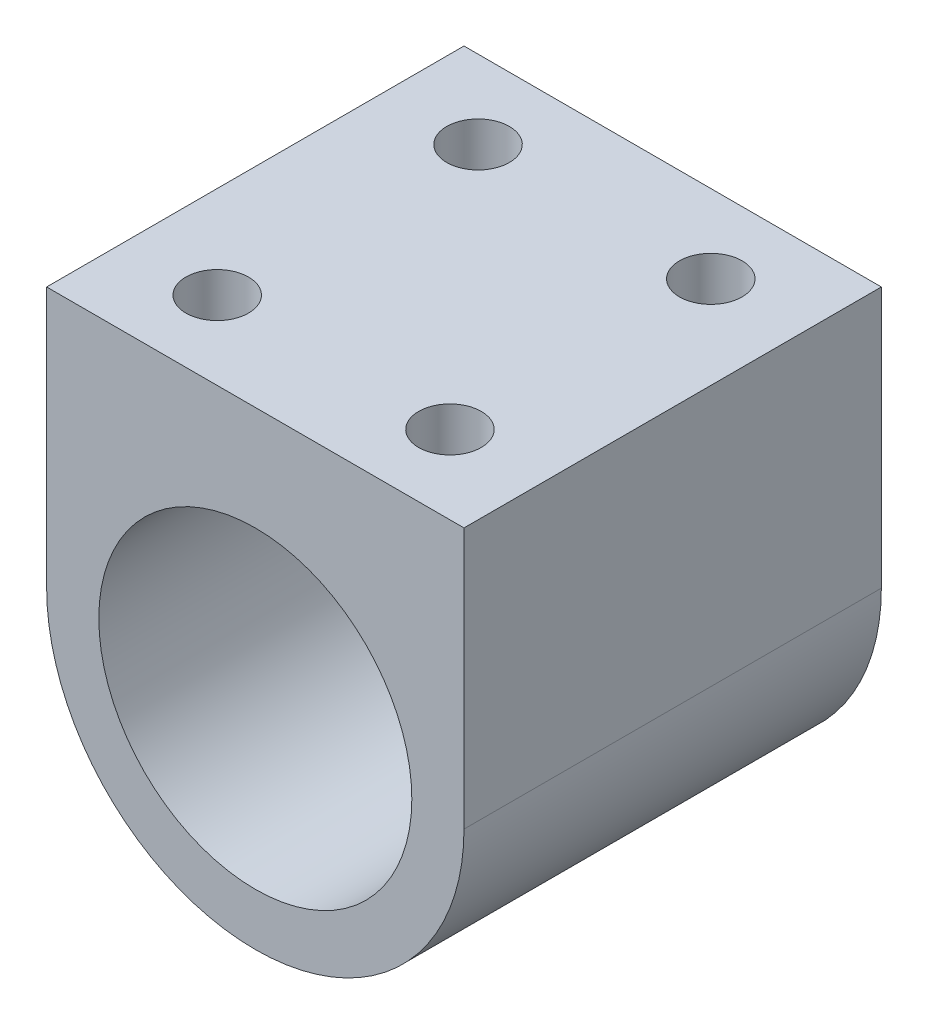
ISO-10303-21;
HEADER;
FILE_DESCRIPTION(('STEP AP214'),'2;1');
FILE_NAME('part.step','',(''),(''),'','','');
FILE_SCHEMA(('AUTOMOTIVE_DESIGN { 1 0 10303 214 1 1 1 1 }'));
ENDSEC;
DATA;
#1=APPLICATION_CONTEXT('core data for automotive mechanical design processes');
#2=APPLICATION_PROTOCOL_DEFINITION('international standard','automotive_design',2000,#1);
#3=PRODUCT_CONTEXT('',#1,'mechanical');
#4=PRODUCT('Part','Part','',(#3));
#5=PRODUCT_RELATED_PRODUCT_CATEGORY('part','',(#4));
#6=PRODUCT_DEFINITION_FORMATION('','',#4);
#7=PRODUCT_DEFINITION_CONTEXT('part definition',#1,'design');
#8=PRODUCT_DEFINITION('design','',#6,#7);
#9=PRODUCT_DEFINITION_SHAPE('','',#8);
#10=(LENGTH_UNIT() NAMED_UNIT(*) SI_UNIT(.MILLI.,.METRE.));
#11=(NAMED_UNIT(*) PLANE_ANGLE_UNIT() SI_UNIT($,.RADIAN.));
#12=(NAMED_UNIT(*) SI_UNIT($,.STERADIAN.) SOLID_ANGLE_UNIT());
#13=UNCERTAINTY_MEASURE_WITH_UNIT(LENGTH_MEASURE(1.E-05),#10,'distance_accuracy_value','');
#14=(GEOMETRIC_REPRESENTATION_CONTEXT(3) GLOBAL_UNCERTAINTY_ASSIGNED_CONTEXT((#13)) GLOBAL_UNIT_ASSIGNED_CONTEXT((#10,
#11,#12)) REPRESENTATION_CONTEXT('',''));
#15=CARTESIAN_POINT('',(0.,0.,0.));
#16=DIRECTION('',(0.,0.,1.));
#17=DIRECTION('',(1.,0.,0.));
#18=AXIS2_PLACEMENT_3D('',#15,#16,#17);
#19=CARTESIAN_POINT('',(0.,0.,40.));
#20=DIRECTION('',(0.,0.,-1.));
#21=DIRECTION('',(-1.,0.,0.));
#22=AXIS2_PLACEMENT_3D('',#19,#20,#21);
#23=CYLINDRICAL_SURFACE('',#22,20.);
#24=CARTESIAN_POINT('',(0.,0.,0.));
#25=DIRECTION('',(0.,0.,1.));
#26=DIRECTION('',(1.,0.,0.));
#27=AXIS2_PLACEMENT_3D('',#24,#25,#26);
#28=CIRCLE('',#27,20.);
#29=CARTESIAN_POINT('',(-20.,0.,0.));
#30=VERTEX_POINT('',#29);
#31=CARTESIAN_POINT('',(20.,0.,0.));
#32=VERTEX_POINT('',#31);
#33=EDGE_CURVE('E100',#30,#32,#28,.T.);
#34=ORIENTED_EDGE('',*,*,#33,.T.);
#35=DIRECTION('',(0.,0.,-1.));
#36=VECTOR('',#35,1.);
#37=CARTESIAN_POINT('',(20.,0.,40.));
#38=LINE('',#37,#36);
#39=CARTESIAN_POINT('',(20.,0.,40.));
#40=VERTEX_POINT('',#39);
#41=EDGE_CURVE('E11',#40,#32,#38,.T.);
#42=ORIENTED_EDGE('',*,*,#41,.F.);
#43=CARTESIAN_POINT('',(0.,0.,40.));
#44=DIRECTION('',(0.,0.,1.));
#45=DIRECTION('',(1.,0.,0.));
#46=AXIS2_PLACEMENT_3D('',#43,#44,#45);
#47=CIRCLE('',#46,20.);
#48=CARTESIAN_POINT('',(-20.,0.,40.));
#49=VERTEX_POINT('',#48);
#50=EDGE_CURVE('E88',#49,#40,#47,.T.);
#51=ORIENTED_EDGE('',*,*,#50,.F.);
#52=DIRECTION('',(0.,0.,-1.));
#53=VECTOR('',#52,1.);
#54=CARTESIAN_POINT('',(-20.,0.,40.));
#55=LINE('',#54,#53);
#56=EDGE_CURVE('E96',#49,#30,#55,.T.);
#57=ORIENTED_EDGE('',*,*,#56,.T.);
#58=EDGE_LOOP('',(#34,#42,#51,#57));
#59=FACE_BOUND('',#58,.T.);
#60=ADVANCED_FACE('F37',(#59),#23,.T.);
#61=CARTESIAN_POINT('',(20.,25.,40.));
#62=DIRECTION('',(-1.,0.,0.));
#63=DIRECTION('',(0.,0.,1.));
#64=AXIS2_PLACEMENT_3D('',#61,#62,#63);
#65=PLANE('',#64);
#66=DIRECTION('',(0.,1.,0.));
#67=VECTOR('',#66,1.);
#68=CARTESIAN_POINT('',(20.,25.,0.));
#69=LINE('',#68,#67);
#70=CARTESIAN_POINT('',(20.,25.,0.));
#71=VERTEX_POINT('',#70);
#72=EDGE_CURVE('E92',#32,#71,#69,.T.);
#73=ORIENTED_EDGE('',*,*,#72,.T.);
#74=DIRECTION('',(0.,0.,-1.));
#75=VECTOR('',#74,1.);
#76=CARTESIAN_POINT('',(20.,25.,40.));
#77=LINE('',#76,#75);
#78=CARTESIAN_POINT('',(20.,25.,40.));
#79=VERTEX_POINT('',#78);
#80=EDGE_CURVE('E45',#79,#71,#77,.T.);
#81=ORIENTED_EDGE('',*,*,#80,.F.);
#82=DIRECTION('',(0.,1.,0.));
#83=VECTOR('',#82,1.);
#84=CARTESIAN_POINT('',(20.,25.,40.));
#85=LINE('',#84,#83);
#86=EDGE_CURVE('E83',#40,#79,#85,.T.);
#87=ORIENTED_EDGE('',*,*,#86,.F.);
#88=ORIENTED_EDGE('',*,*,#41,.T.);
#89=EDGE_LOOP('',(#73,#81,#87,#88));
#90=FACE_BOUND('',#89,.T.);
#91=ADVANCED_FACE('F91',(#90),#65,.F.);
#92=CARTESIAN_POINT('',(20.,25.,40.));
#93=DIRECTION('',(0.,-1.,0.));
#94=DIRECTION('',(0.,0.,-1.));
#95=AXIS2_PLACEMENT_3D('',#92,#93,#94);
#96=PLANE('',#95);
#97=CARTESIAN_POINT('',(-11.1539641975774,25.,7.5));
#98=DIRECTION('',(0.,1.,0.));
#99=DIRECTION('',(0.,0.,-1.));
#100=AXIS2_PLACEMENT_3D('',#97,#98,#99);
#101=CIRCLE('',#100,3.);
#102=CARTESIAN_POINT('',(-11.1539641975774,25.,4.5));
#103=VERTEX_POINT('',#102);
#104=EDGE_CURVE('E123',#103,#103,#101,.T.);
#105=ORIENTED_EDGE('',*,*,#104,.F.);
#106=EDGE_LOOP('',(#105));
#107=FACE_BOUND('',#106,.T.);
#108=CARTESIAN_POINT('',(11.1539641975774,25.,32.5));
#109=DIRECTION('',(0.,1.,0.));
#110=DIRECTION('',(0.,0.,1.));
#111=AXIS2_PLACEMENT_3D('',#108,#109,#110);
#112=CIRCLE('',#111,3.);
#113=CARTESIAN_POINT('',(11.1539641975774,25.,35.5));
#114=VERTEX_POINT('',#113);
#115=EDGE_CURVE('E129',#114,#114,#112,.T.);
#116=ORIENTED_EDGE('',*,*,#115,.F.);
#117=EDGE_LOOP('',(#116));
#118=FACE_BOUND('',#117,.T.);
#119=CARTESIAN_POINT('',(-11.1539641975774,25.,32.5));
#120=DIRECTION('',(0.,1.,0.));
#121=DIRECTION('',(0.,0.,-1.));
#122=AXIS2_PLACEMENT_3D('',#119,#120,#121);
#123=CIRCLE('',#122,3.);
#124=CARTESIAN_POINT('',(-11.1539641975774,25.,29.5));
#125=VERTEX_POINT('',#124);
#126=EDGE_CURVE('E130',#125,#125,#123,.T.);
#127=ORIENTED_EDGE('',*,*,#126,.F.);
#128=EDGE_LOOP('',(#127));
#129=FACE_BOUND('',#128,.T.);
#130=CARTESIAN_POINT('',(11.1539641975774,25.,7.5));
#131=DIRECTION('',(0.,1.,0.));
#132=DIRECTION('',(0.,0.,1.));
#133=AXIS2_PLACEMENT_3D('',#130,#131,#132);
#134=CIRCLE('',#133,3.);
#135=CARTESIAN_POINT('',(11.1539641975774,25.,10.5));
#136=VERTEX_POINT('',#135);
#137=EDGE_CURVE('E120',#136,#136,#134,.T.);
#138=ORIENTED_EDGE('',*,*,#137,.F.);
#139=EDGE_LOOP('',(#138));
#140=FACE_BOUND('',#139,.T.);
#141=DIRECTION('',(-1.,0.,0.));
#142=VECTOR('',#141,1.);
#143=CARTESIAN_POINT('',(20.,25.,0.));
#144=LINE('',#143,#142);
#145=CARTESIAN_POINT('',(-20.,25.,0.));
#146=VERTEX_POINT('',#145);
#147=EDGE_CURVE('E70',#71,#146,#144,.T.);
#148=ORIENTED_EDGE('',*,*,#147,.T.);
#149=DIRECTION('',(0.,0.,-1.));
#150=VECTOR('',#149,1.);
#151=CARTESIAN_POINT('',(-20.,25.,40.));
#152=LINE('',#151,#150);
#153=CARTESIAN_POINT('',(-20.,25.,40.));
#154=VERTEX_POINT('',#153);
#155=EDGE_CURVE('E93',#154,#146,#152,.T.);
#156=ORIENTED_EDGE('',*,*,#155,.F.);
#157=DIRECTION('',(-1.,0.,0.));
#158=VECTOR('',#157,1.);
#159=CARTESIAN_POINT('',(20.,25.,40.));
#160=LINE('',#159,#158);
#161=EDGE_CURVE('E86',#79,#154,#160,.T.);
#162=ORIENTED_EDGE('',*,*,#161,.F.);
#163=ORIENTED_EDGE('',*,*,#80,.T.);
#164=EDGE_LOOP('',(#148,#156,#162,#163));
#165=FACE_BOUND('',#164,.T.);
#166=ADVANCED_FACE('F94',(#107,#118,#129,#140,#165),#96,.F.);
#167=CARTESIAN_POINT('',(-20.,25.,40.));
#168=DIRECTION('',(1.,0.,0.));
#169=DIRECTION('',(0.,0.,-1.));
#170=AXIS2_PLACEMENT_3D('',#167,#168,#169);
#171=PLANE('',#170);
#172=DIRECTION('',(0.,-1.,0.));
#173=VECTOR('',#172,1.);
#174=CARTESIAN_POINT('',(-20.,25.,0.));
#175=LINE('',#174,#173);
#176=EDGE_CURVE('E76',#146,#30,#175,.T.);
#177=ORIENTED_EDGE('',*,*,#176,.T.);
#178=ORIENTED_EDGE('',*,*,#56,.F.);
#179=DIRECTION('',(0.,-1.,0.));
#180=VECTOR('',#179,1.);
#181=CARTESIAN_POINT('',(-20.,25.,40.));
#182=LINE('',#181,#180);
#183=EDGE_CURVE('E53',#154,#49,#182,.T.);
#184=ORIENTED_EDGE('',*,*,#183,.F.);
#185=ORIENTED_EDGE('',*,*,#155,.T.);
#186=EDGE_LOOP('',(#177,#178,#184,#185));
#187=FACE_BOUND('',#186,.T.);
#188=ADVANCED_FACE('F108',(#187),#171,.F.);
#189=CARTESIAN_POINT('',(0.,0.,40.));
#190=DIRECTION('',(0.,0.,1.));
#191=DIRECTION('',(1.,0.,0.));
#192=AXIS2_PLACEMENT_3D('',#189,#190,#191);
#193=PLANE('',#192);
#194=CARTESIAN_POINT('',(0.,0.,40.));
#195=DIRECTION('',(0.,0.,1.));
#196=DIRECTION('',(1.,0.,0.));
#197=AXIS2_PLACEMENT_3D('',#194,#195,#196);
#198=CIRCLE('',#197,15.);
#199=CARTESIAN_POINT('',(15.,0.,40.));
#200=VERTEX_POINT('',#199);
#201=EDGE_CURVE('E114',#200,#200,#198,.T.);
#202=ORIENTED_EDGE('',*,*,#201,.F.);
#203=EDGE_LOOP('',(#202));
#204=FACE_BOUND('',#203,.T.);
#205=ORIENTED_EDGE('',*,*,#50,.T.);
#206=ORIENTED_EDGE('',*,*,#86,.T.);
#207=ORIENTED_EDGE('',*,*,#161,.T.);
#208=ORIENTED_EDGE('',*,*,#183,.T.);
#209=EDGE_LOOP('',(#205,#206,#207,#208));
#210=FACE_BOUND('',#209,.T.);
#211=ADVANCED_FACE('F84',(#204,#210),#193,.T.);
#212=CARTESIAN_POINT('',(0.,0.,0.));
#213=DIRECTION('',(0.,0.,1.));
#214=DIRECTION('',(1.,0.,0.));
#215=AXIS2_PLACEMENT_3D('',#212,#213,#214);
#216=PLANE('',#215);
#217=ORIENTED_EDGE('',*,*,#33,.F.);
#218=ORIENTED_EDGE('',*,*,#176,.F.);
#219=ORIENTED_EDGE('',*,*,#147,.F.);
#220=ORIENTED_EDGE('',*,*,#72,.F.);
#221=EDGE_LOOP('',(#217,#218,#219,#220));
#222=FACE_BOUND('',#221,.T.);
#223=ADVANCED_FACE('F111',(#222),#216,.F.);
#224=CARTESIAN_POINT('',(0.,0.,5.));
#225=DIRECTION('',(0.,0.,1.));
#226=DIRECTION('',(1.,0.,0.));
#227=AXIS2_PLACEMENT_3D('',#224,#225,#226);
#228=CYLINDRICAL_SURFACE('',#227,15.);
#229=CARTESIAN_POINT('',(0.,0.,5.));
#230=DIRECTION('',(0.,0.,1.));
#231=DIRECTION('',(1.,0.,0.));
#232=AXIS2_PLACEMENT_3D('',#229,#230,#231);
#233=CIRCLE('',#232,15.);
#234=CARTESIAN_POINT('',(15.,0.,5.));
#235=VERTEX_POINT('',#234);
#236=EDGE_CURVE('E103',#235,#235,#233,.T.);
#237=ORIENTED_EDGE('',*,*,#236,.F.);
#238=EDGE_LOOP('',(#237));
#239=FACE_BOUND('',#238,.T.);
#240=ORIENTED_EDGE('',*,*,#201,.T.);
#241=EDGE_LOOP('',(#240));
#242=FACE_BOUND('',#241,.T.);
#243=ADVANCED_FACE('F164',(#239,#242),#228,.F.);
#244=CARTESIAN_POINT('',(0.,0.,5.));
#245=DIRECTION('',(0.,0.,1.));
#246=DIRECTION('',(1.,0.,0.));
#247=AXIS2_PLACEMENT_3D('',#244,#245,#246);
#248=PLANE('',#247);
#249=ORIENTED_EDGE('',*,*,#236,.T.);
#250=EDGE_LOOP('',(#249));
#251=FACE_BOUND('',#250,.T.);
#252=ADVANCED_FACE('F155',(#251),#248,.T.);
#253=CARTESIAN_POINT('',(11.1539641975774,13.,7.5));
#254=DIRECTION('',(0.,1.,0.));
#255=DIRECTION('',(0.,0.,1.));
#256=AXIS2_PLACEMENT_3D('',#253,#254,#255);
#257=CYLINDRICAL_SURFACE('',#256,3.);
#258=CARTESIAN_POINT('',(11.1539641975774,13.,7.5));
#259=DIRECTION('',(0.,1.,0.));
#260=DIRECTION('',(0.,0.,1.));
#261=AXIS2_PLACEMENT_3D('',#258,#259,#260);
#262=CIRCLE('',#261,3.);
#263=CARTESIAN_POINT('',(11.1539641975774,13.,10.5));
#264=VERTEX_POINT('',#263);
#265=EDGE_CURVE('E117',#264,#264,#262,.T.);
#266=ORIENTED_EDGE('',*,*,#265,.F.);
#267=EDGE_LOOP('',(#266));
#268=FACE_BOUND('',#267,.T.);
#269=ORIENTED_EDGE('',*,*,#137,.T.);
#270=EDGE_LOOP('',(#269));
#271=FACE_BOUND('',#270,.T.);
#272=ADVANCED_FACE('F152',(#268,#271),#257,.F.);
#273=CARTESIAN_POINT('',(11.1539641975774,13.,7.5));
#274=DIRECTION('',(0.,1.,0.));
#275=DIRECTION('',(0.,0.,1.));
#276=AXIS2_PLACEMENT_3D('',#273,#274,#275);
#277=PLANE('',#276);
#278=ORIENTED_EDGE('',*,*,#265,.T.);
#279=EDGE_LOOP('',(#278));
#280=FACE_BOUND('',#279,.T.);
#281=ADVANCED_FACE('F154',(#280),#277,.T.);
#282=CARTESIAN_POINT('',(-11.1539641975774,13.,32.5));
#283=DIRECTION('',(0.,1.,0.));
#284=DIRECTION('',(0.,0.,1.));
#285=AXIS2_PLACEMENT_3D('',#282,#283,#284);
#286=CYLINDRICAL_SURFACE('',#285,3.);
#287=CARTESIAN_POINT('',(-11.1539641975774,13.,32.5));
#288=DIRECTION('',(0.,1.,0.));
#289=DIRECTION('',(0.,0.,-1.));
#290=AXIS2_PLACEMENT_3D('',#287,#288,#289);
#291=CIRCLE('',#290,3.);
#292=CARTESIAN_POINT('',(-11.1539641975774,13.,29.5));
#293=VERTEX_POINT('',#292);
#294=EDGE_CURVE('E138',#293,#293,#291,.T.);
#295=ORIENTED_EDGE('',*,*,#294,.F.);
#296=EDGE_LOOP('',(#295));
#297=FACE_BOUND('',#296,.T.);
#298=ORIENTED_EDGE('',*,*,#126,.T.);
#299=EDGE_LOOP('',(#298));
#300=FACE_BOUND('',#299,.T.);
#301=ADVANCED_FACE('F144',(#297,#300),#286,.F.);
#302=CARTESIAN_POINT('',(-11.1539641975774,13.,32.5));
#303=DIRECTION('',(0.,-1.,0.));
#304=DIRECTION('',(0.,0.,-1.));
#305=AXIS2_PLACEMENT_3D('',#302,#303,#304);
#306=PLANE('',#305);
#307=ORIENTED_EDGE('',*,*,#294,.T.);
#308=EDGE_LOOP('',(#307));
#309=FACE_BOUND('',#308,.T.);
#310=ADVANCED_FACE('F227',(#309),#306,.F.);
#311=CARTESIAN_POINT('',(11.1539641975774,13.,32.5));
#312=DIRECTION('',(0.,1.,0.));
#313=DIRECTION('',(0.,0.,1.));
#314=AXIS2_PLACEMENT_3D('',#311,#312,#313);
#315=CYLINDRICAL_SURFACE('',#314,3.);
#316=CARTESIAN_POINT('',(11.1539641975774,13.,32.5));
#317=DIRECTION('',(0.,1.,0.));
#318=DIRECTION('',(0.,0.,1.));
#319=AXIS2_PLACEMENT_3D('',#316,#317,#318);
#320=CIRCLE('',#319,3.);
#321=CARTESIAN_POINT('',(11.1539641975774,13.,35.5));
#322=VERTEX_POINT('',#321);
#323=EDGE_CURVE('E126',#322,#322,#320,.T.);
#324=ORIENTED_EDGE('',*,*,#323,.F.);
#325=EDGE_LOOP('',(#324));
#326=FACE_BOUND('',#325,.T.);
#327=ORIENTED_EDGE('',*,*,#115,.T.);
#328=EDGE_LOOP('',(#327));
#329=FACE_BOUND('',#328,.T.);
#330=ADVANCED_FACE('F238',(#326,#329),#315,.F.);
#331=CARTESIAN_POINT('',(11.1539641975774,13.,32.5));
#332=DIRECTION('',(0.,1.,0.));
#333=DIRECTION('',(0.,0.,1.));
#334=AXIS2_PLACEMENT_3D('',#331,#332,#333);
#335=PLANE('',#334);
#336=ORIENTED_EDGE('',*,*,#323,.T.);
#337=EDGE_LOOP('',(#336));
#338=FACE_BOUND('',#337,.T.);
#339=ADVANCED_FACE('F249',(#338),#335,.T.);
#340=CARTESIAN_POINT('',(-11.1539641975774,13.,7.5));
#341=DIRECTION('',(0.,1.,0.));
#342=DIRECTION('',(0.,0.,1.));
#343=AXIS2_PLACEMENT_3D('',#340,#341,#342);
#344=CYLINDRICAL_SURFACE('',#343,3.);
#345=CARTESIAN_POINT('',(-11.1539641975774,13.,7.5));
#346=DIRECTION('',(0.,1.,0.));
#347=DIRECTION('',(0.,0.,-1.));
#348=AXIS2_PLACEMENT_3D('',#345,#346,#347);
#349=CIRCLE('',#348,3.);
#350=CARTESIAN_POINT('',(-11.1539641975774,13.,4.5));
#351=VERTEX_POINT('',#350);
#352=EDGE_CURVE('E133',#351,#351,#349,.T.);
#353=ORIENTED_EDGE('',*,*,#352,.F.);
#354=EDGE_LOOP('',(#353));
#355=FACE_BOUND('',#354,.T.);
#356=ORIENTED_EDGE('',*,*,#104,.T.);
#357=EDGE_LOOP('',(#356));
#358=FACE_BOUND('',#357,.T.);
#359=ADVANCED_FACE('F260',(#355,#358),#344,.F.);
#360=CARTESIAN_POINT('',(-11.1539641975774,13.,7.5));
#361=DIRECTION('',(0.,-1.,0.));
#362=DIRECTION('',(0.,0.,-1.));
#363=AXIS2_PLACEMENT_3D('',#360,#361,#362);
#364=PLANE('',#363);
#365=ORIENTED_EDGE('',*,*,#352,.T.);
#366=EDGE_LOOP('',(#365));
#367=FACE_BOUND('',#366,.T.);
#368=ADVANCED_FACE('F271',(#367),#364,.F.);
#369=CLOSED_SHELL('',(#60,#91,#166,#188,#211,#223,#243,#252,#272,#281,#301,#310,#330,#339,#359,#368));
#370=MANIFOLD_SOLID_BREP('B2',#369);
#371=ADVANCED_BREP_SHAPE_REPRESENTATION('',(#18,#370),#14);
#372=SHAPE_DEFINITION_REPRESENTATION(#9,#371);
ENDSEC;
END-ISO-10303-21;
